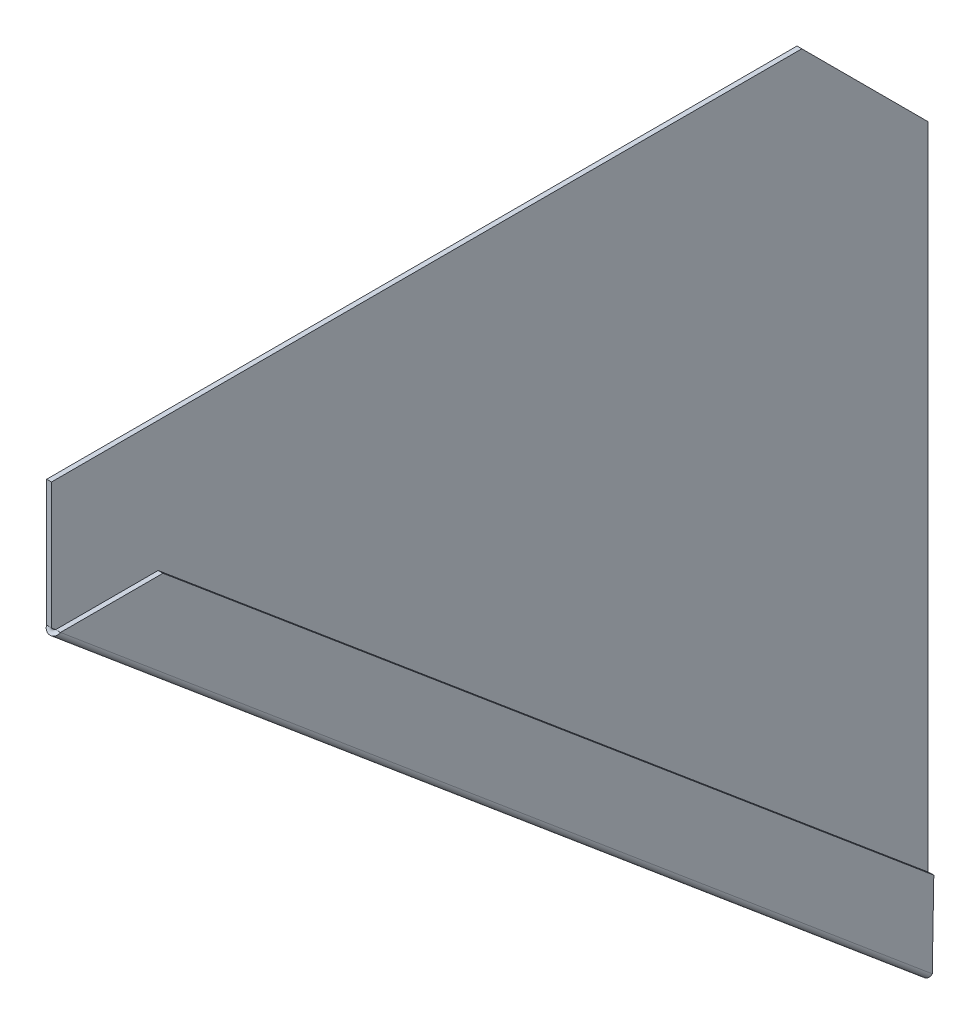
ISO-10303-21;
HEADER;
FILE_DESCRIPTION(('STEP AP214'),'2;1');
FILE_NAME('part.step','',(''),(''),'','','');
FILE_SCHEMA(('AUTOMOTIVE_DESIGN { 1 0 10303 214 1 1 1 1 }'));
ENDSEC;
DATA;
#1=APPLICATION_CONTEXT('core data for automotive mechanical design processes');
#2=APPLICATION_PROTOCOL_DEFINITION('international standard','automotive_design',2000,#1);
#3=PRODUCT_CONTEXT('',#1,'mechanical');
#4=PRODUCT('Part','Part','',(#3));
#5=PRODUCT_RELATED_PRODUCT_CATEGORY('part','',(#4));
#6=PRODUCT_DEFINITION_FORMATION('','',#4);
#7=PRODUCT_DEFINITION_CONTEXT('part definition',#1,'design');
#8=PRODUCT_DEFINITION('design','',#6,#7);
#9=PRODUCT_DEFINITION_SHAPE('','',#8);
#10=(LENGTH_UNIT() NAMED_UNIT(*) SI_UNIT(.MILLI.,.METRE.));
#11=(NAMED_UNIT(*) PLANE_ANGLE_UNIT() SI_UNIT($,.RADIAN.));
#12=(NAMED_UNIT(*) SI_UNIT($,.STERADIAN.) SOLID_ANGLE_UNIT());
#13=UNCERTAINTY_MEASURE_WITH_UNIT(LENGTH_MEASURE(1.E-05),#10,'distance_accuracy_value','');
#14=(GEOMETRIC_REPRESENTATION_CONTEXT(3) GLOBAL_UNCERTAINTY_ASSIGNED_CONTEXT((#13)) GLOBAL_UNIT_ASSIGNED_CONTEXT((#10,
#11,#12)) REPRESENTATION_CONTEXT('',''));
#15=CARTESIAN_POINT('',(0.,0.,0.));
#16=DIRECTION('',(0.,0.,1.));
#17=DIRECTION('',(1.,0.,0.));
#18=AXIS2_PLACEMENT_3D('',#15,#16,#17);
#19=CARTESIAN_POINT('',(0.05,-93.4944106675415,-0.424239822393119));
#20=DIRECTION('',(0.,-0.642787609686543,-0.766044443118975));
#21=DIRECTION('',(1.,0.,0.));
#22=AXIS2_PLACEMENT_3D('',#19,#20,#21);
#23=CYLINDRICAL_SURFACE('',#22,0.66);
#24=DIRECTION('',(0.,-0.642787609686543,-0.766044443118975));
#25=VECTOR('',#24,1.);
#26=CARTESIAN_POINT('',(-0.61,-93.4944106675415,-0.424239822393119));
#27=LINE('',#26,#25);
#28=CARTESIAN_POINT('',(-0.61,-92.9734940306687,0.196564451042147));
#29=VERTEX_POINT('',#28);
#30=CARTESIAN_POINT('',(-0.61,0.00162787163827149,111.));
#31=VERTEX_POINT('',#30);
#32=EDGE_CURVE('E169',#29,#31,#27,.F.);
#33=ORIENTED_EDGE('',*,*,#32,.F.);
#34=CARTESIAN_POINT('',(0.05,-92.9734940306687,0.196564451042144));
#35=DIRECTION('',(0.,0.64278760968654,0.766044443118977));
#36=DIRECTION('',(0.,0.766044443118977,-0.64278760968654));
#37=AXIS2_PLACEMENT_3D('',#34,#35,#36);
#38=CIRCLE('',#37,0.66);
#39=CARTESIAN_POINT('',(0.71,-92.9734940306688,0.196564451042199));
#40=VERTEX_POINT('',#39);
#41=EDGE_CURVE('E139',#29,#40,#38,.T.);
#42=ORIENTED_EDGE('',*,*,#41,.T.);
#43=DIRECTION('',(0.,0.642787609686543,0.766044443118975));
#44=VECTOR('',#43,1.);
#45=CARTESIAN_POINT('',(0.71,-46.924381137202,55.0757601776069));
#46=LINE('',#45,#44);
#47=CARTESIAN_POINT('',(0.71,-0.354351606862397,110.575760177607));
#48=VERTEX_POINT('',#47);
#49=EDGE_CURVE('E254',#40,#48,#46,.T.);
#50=ORIENTED_EDGE('',*,*,#49,.T.);
#51=CARTESIAN_POINT('',(-0.61,0.00162787163869582,111.));
#52=CARTESIAN_POINT('',(-0.610000229078599,-0.00849888260646574,111.004732032463));
#53=CARTESIAN_POINT('',(-0.609734955302613,-0.0186256219196172,111.009464052396));
#54=CARTESIAN_POINT('',(-0.60867504688825,-0.038859178923152,111.018911376037));
#55=CARTESIAN_POINT('',(-0.607880412249873,-0.0489659966135353,111.023626679745));
#56=CARTESIAN_POINT('',(-0.605763426957498,-0.0691398186128102,111.033023879765));
#57=CARTESIAN_POINT('',(-0.604441076303501,-0.0792068229217017,111.037705776079));
#58=CARTESIAN_POINT('',(-0.601271916850118,-0.0992812351727994,111.047019561417));
#59=CARTESIAN_POINT('',(-0.599425108050733,-0.109288643115006,111.051651450441));
#60=CARTESIAN_POINT('',(-0.595211462081673,-0.129224219774727,111.060848738885));
#61=CARTESIAN_POINT('',(-0.592844624911999,-0.139152388492241,111.065414138305));
#62=CARTESIAN_POINT('',(-0.587596629304977,-0.158910035662041,111.07446212618));
#63=CARTESIAN_POINT('',(-0.58471547086763,-0.168739514114326,111.078944714635));
#64=CARTESIAN_POINT('',(-0.578445772299098,-0.188280567219267,111.08781095851));
#65=CARTESIAN_POINT('',(-0.575057232167914,-0.197992141871923,111.09219461393));
#66=CARTESIAN_POINT('',(-0.567780933873921,-0.217278457950041,111.10084710806));
#67=CARTESIAN_POINT('',(-0.563893175711112,-0.226853199375503,111.105115946769));
#68=CARTESIAN_POINT('',(-0.555627807204068,-0.245847249197165,111.113523200391));
#69=CARTESIAN_POINT('',(-0.551250196859833,-0.255266557593364,111.117661615303));
#70=CARTESIAN_POINT('',(-0.542015670063422,-0.273931516010969,111.125792728449));
#71=CARTESIAN_POINT('',(-0.537158753611246,-0.283177166032374,111.129785426683));
#72=CARTESIAN_POINT('',(-0.526977315328931,-0.301477000711785,111.137610164635));
#73=CARTESIAN_POINT('',(-0.521652793498792,-0.31053118536979,111.141442204353));
#74=CARTESIAN_POINT('',(-0.510548971701942,-0.328430743591031,111.148931070476));
#75=CARTESIAN_POINT('',(-0.504769671735229,-0.337276117154267,111.152587896882));
#76=CARTESIAN_POINT('',(-0.492770216504538,-0.354741210498654,111.159712203687));
#77=CARTESIAN_POINT('',(-0.486550061240559,-0.363360930279805,111.163179684087));
#78=CARTESIAN_POINT('',(-0.473683880314327,-0.380358416992522,111.169911622341));
#79=CARTESIAN_POINT('',(-0.467037854652074,-0.388736183924087,111.173176080194));
#80=CARTESIAN_POINT('',(-0.453335943787202,-0.405234048755683,111.179488785911));
#81=CARTESIAN_POINT('',(-0.446280058584582,-0.413354146655714,111.182537033775));
#82=CARTESIAN_POINT('',(-0.431775426884458,-0.429321577989586,111.18840465294));
#83=CARTESIAN_POINT('',(-0.424326680386953,-0.437168911423428,111.191224024241));
#84=CARTESIAN_POINT('',(-0.409054270779806,-0.452576375503747,111.19662177509));
#85=CARTESIAN_POINT('',(-0.401230607670163,-0.460136506150225,111.199200154638));
#86=CARTESIAN_POINT('',(-0.385227212728443,-0.474955818231324,111.204104387361));
#87=CARTESIAN_POINT('',(-0.377047480896365,-0.482214999665946,111.206430240536));
#88=CARTESIAN_POINT('',(-0.360351654200215,-0.496419391911829,111.210818494253));
#89=CARTESIAN_POINT('',(-0.351835559336144,-0.50336460272309,111.212880894794));
#90=CARTESIAN_POINT('',(-0.334487522594458,-0.516928788693508,111.216731951661));
#91=CARTESIAN_POINT('',(-0.325655580716843,-0.523547763852667,111.218520607986));
#92=CARTESIAN_POINT('',(-0.30769712686964,-0.53644799942037,111.221814544315));
#93=CARTESIAN_POINT('',(-0.298570614900052,-0.542729259828915,111.223319824318));
#94=CARTESIAN_POINT('',(-0.280045007435628,-0.554943400381327,111.226038058572));
#95=CARTESIAN_POINT('',(-0.270645911940791,-0.560876280525193,111.227251012824));
#96=CARTESIAN_POINT('',(-0.251597780670174,-0.572383834312719,111.229376350384));
#97=CARTESIAN_POINT('',(-0.241948744894393,-0.577958507956379,111.230288733694));
#98=CARTESIAN_POINT('',(-0.222423978434238,-0.588740685458844,111.231805408281));
#99=CARTESIAN_POINT('',(-0.212548247749863,-0.59394818931765,111.232409699559));
#100=CARTESIAN_POINT('',(-0.192593882972736,-0.603987948509858,111.233303411216));
#101=CARTESIAN_POINT('',(-0.182515248879984,-0.60882020384326,111.233592831595));
#102=CARTESIAN_POINT('',(-0.162179357598432,-0.618102291250783,111.233850781137));
#103=CARTESIAN_POINT('',(-0.151922100409632,-0.622552123324905,111.2338193103));
#104=CARTESIAN_POINT('',(-0.131253673566965,-0.631063110770988,111.233430230149));
#105=CARTESIAN_POINT('',(-0.120842503913098,-0.635124266142951,111.233072620835));
#106=CARTESIAN_POINT('',(-0.0998913335599178,-0.642852583098186,111.232026802163));
#107=CARTESIAN_POINT('',(-0.089351332860605,-0.646519744681459,111.231338592806));
#108=CARTESIAN_POINT('',(-0.0681678922014045,-0.653455706138236,111.229627908928));
#109=CARTESIAN_POINT('',(-0.0575244522415167,-0.65672450601174,111.228605434407));
#110=CARTESIAN_POINT('',(-0.0361597740402866,-0.662860335816186,111.226223360355));
#111=CARTESIAN_POINT('',(-0.0254385357989442,-0.665727365747128,111.224863760823));
#112=CARTESIAN_POINT('',(-0.0039440894368019,-0.671057215332676,111.221805389067));
#113=CARTESIAN_POINT('',(0.00682911868399814,-0.673520034987281,111.220106616841));
#114=CARTESIAN_POINT('',(0.028401551203077,-0.678039997464262,111.21636866911));
#115=CARTESIAN_POINT('',(0.0392007756013557,-0.680097140286639,111.214329493605));
#116=CARTESIAN_POINT('',(0.0607992243979113,-0.683805259854365,111.209910328788));
#117=CARTESIAN_POINT('',(0.0715984487961882,-0.685456236599715,111.207530339477));
#118=CARTESIAN_POINT('',(0.0931708813152699,-0.688352513258186,111.202429957575));
#119=CARTESIAN_POINT('',(0.103944089436075,-0.689597813171307,111.199709564984));
#120=CARTESIAN_POINT('',(0.12543853579822,-0.691684202721214,111.193929607107));
#121=CARTESIAN_POINT('',(0.13615977403956,-0.692525292358001,111.190870041822));
#122=CARTESIAN_POINT('',(0.157524452240791,-0.693805701689001,111.184413786241));
#123=CARTESIAN_POINT('',(0.168167892200681,-0.694245021383215,111.181017095946));
#124=CARTESIAN_POINT('',(0.189351332859889,-0.694725299061889,111.17388945019));
#125=CARTESIAN_POINT('',(0.199891333559207,-0.694766257046349,111.170158494731));
#126=CARTESIAN_POINT('',(0.220842503912392,-0.694454179226554,111.162365983769));
#127=CARTESIAN_POINT('',(0.231253673566259,-0.694101143422298,111.158304428267));
#128=CARTESIAN_POINT('',(0.251922100408931,-0.693006395111668,111.149855178785));
#129=CARTESIAN_POINT('',(0.262179357597737,-0.692264682605294,111.145467484805));
#130=CARTESIAN_POINT('',(0.2825152488793,-0.690398834333232,111.13637120563));
#131=CARTESIAN_POINT('',(0.292593882972057,-0.689274698567545,111.131662620435));
#132=CARTESIAN_POINT('',(0.312548247749192,-0.686651178510781,111.121930579145));
#133=CARTESIAN_POINT('',(0.322423978433569,-0.685151794219704,111.11690712305));
#134=CARTESIAN_POINT('',(0.341948744893734,-0.681785855852694,111.106552118829));
#135=CARTESIAN_POINT('',(0.351597780669522,-0.679919301776761,111.101220570703));
#136=CARTESIAN_POINT('',(0.370645911940152,-0.675827987124687,111.09025690351));
#137=CARTESIAN_POINT('',(0.380045007434994,-0.673603226548546,111.084624784442));
#138=CARTESIAN_POINT('',(0.39857061489943,-0.668805325131589,111.073068220554));
#139=CARTESIAN_POINT('',(0.407697126869025,-0.666232184290774,111.067143775734));
#140=CARTESIAN_POINT('',(0.425655580716241,-0.660748187858516,111.055011509772));
#141=CARTESIAN_POINT('',(0.434487522593862,-0.657837332267073,111.04880368863));
#142=CARTESIAN_POINT('',(0.451835559335561,-0.651689385432083,111.03611430213));
#143=CARTESIAN_POINT('',(0.460351654199639,-0.648452294188535,111.029632736773));
#144=CARTESIAN_POINT('',(0.477047480895806,-0.641664141078102,111.016406153423));
#145=CARTESIAN_POINT('',(0.485227212727894,-0.638113079211217,111.009661135431));
#146=CARTESIAN_POINT('',(0.50123060766963,-0.630710006265576,110.995918573075));
#147=CARTESIAN_POINT('',(0.509054270779277,-0.62685799518682,110.98892102871));
#148=CARTESIAN_POINT('',(0.524326680386441,-0.618866770241935,110.974684948228));
#149=CARTESIAN_POINT('',(0.531775426883959,-0.614727556375807,110.96744641211));
#150=CARTESIAN_POINT('',(0.546280058584102,-0.606176364177374,110.952740463312));
#151=CARTESIAN_POINT('',(0.553335943786727,-0.601764385845071,110.945273050632));
#152=CARTESIAN_POINT('',(0.567037854651617,-0.592682760148941,110.930122015281));
#153=CARTESIAN_POINT('',(0.573683880313882,-0.588013112785115,110.922438392612));
#154=CARTESIAN_POINT('',(0.586550061240134,-0.578431865207837,110.906868124725));
#155=CARTESIAN_POINT('',(0.592770216504121,-0.573520264994383,110.898981479508));
#156=CARTESIAN_POINT('',(0.604769671734832,-0.563471410785441,110.88301884307));
#157=CARTESIAN_POINT('',(0.610548971701556,-0.558334156789954,110.874942851848));
#158=CARTESIAN_POINT('',(0.621652793498427,-0.547850837704154,110.858615656091));
#159=CARTESIAN_POINT('',(0.626977315328573,-0.542504772613843,110.850364451556));
#160=CARTESIAN_POINT('',(0.637158753610909,-0.53162117706986,110.833701383971));
#161=CARTESIAN_POINT('',(0.642015670063098,-0.526083646616189,110.825289520921));
#162=CARTESIAN_POINT('',(0.651250196859532,-0.514834927334035,110.808320078142));
#163=CARTESIAN_POINT('',(0.655627807203778,-0.509123738505553,110.799762498413));
#164=CARTESIAN_POINT('',(0.663893175710843,-0.497545927819316,110.782516915158));
#165=CARTESIAN_POINT('',(0.667780933873662,-0.49167930596156,110.773828911632));
#166=CARTESIAN_POINT('',(0.675057232167678,-0.479809229018883,110.756338087869));
#167=CARTESIAN_POINT('',(0.678445772298874,-0.473805773933962,110.747535267632));
#168=CARTESIAN_POINT('',(0.684715470867429,-0.461680959964465,110.729830694124));
#169=CARTESIAN_POINT('',(0.687596629304788,-0.455559601079891,110.720928940853));
#170=CARTESIAN_POINT('',(0.692844624911833,-0.44321819304553,110.703042623345));
#171=CARTESIAN_POINT('',(0.695211462081519,-0.436998143895744,110.694058059108));
#172=CARTESIAN_POINT('',(0.699425108050602,-0.424478806371456,110.676022441031));
#173=CARTESIAN_POINT('',(0.701271916849999,-0.418179517996955,110.66697138719));
#174=CARTESIAN_POINT('',(0.704441076303406,-0.405521344881291,110.648819272219));
#175=CARTESIAN_POINT('',(0.705763426957414,-0.39916246014013,110.639718211089));
#176=CARTESIAN_POINT('',(0.707880412249813,-0.386404877276293,110.621482681435));
#177=CARTESIAN_POINT('',(0.708675046888202,-0.380006179153617,110.612348212911));
#178=CARTESIAN_POINT('',(0.70973495530259,-0.367188861285508,110.594062559637));
#179=CARTESIAN_POINT('',(0.710000229078587,-0.360770241540074,110.584911374887));
#180=CARTESIAN_POINT('',(0.71,-0.354351606862646,110.575760177607));
#181=B_SPLINE_CURVE_WITH_KNOTS('',3,(#51,#52,#53,#54,#55,#56,#57,#58,#59,#60,#61,#62,#63,#64,
#65,#66,#67,#68,#69,#70,#71,#72,#73,#74,#75,#76,#77,#78,#79,#80,#81,#82,#83,#84,#85,#86,#87,#88,
#89,#90,#91,#92,#93,#94,#95,#96,#97,#98,#99,#100,#101,#102,#103,#104,#105,#106,#107,#108,#109,
#110,#111,#112,#113,#114,#115,#116,#117,#118,#119,#120,#121,#122,#123,#124,#125,#126,#127,#128,
#129,#130,#131,#132,#133,#134,#135,#136,#137,#138,#139,#140,#141,#142,#143,#144,#145,#146,#147,
#148,#149,#150,#151,#152,#153,#154,#155,#156,#157,#158,#159,#160,#161,#162,#163,#164,#165,#166,
#167,#168,#169,#170,#171,#172,#173,#174,#175,#176,#177,#178,#179,#180),.UNSPECIFIED.,.F.,.F.,(4,
2,2,2,2,2,2,2,2,2,2,2,2,2,2,2,2,2,2,2,2,2,2,2,2,2,2,2,2,2,2,2,2,2,2,2,2,2,2,2,2,2,2,2,2,2,2,2,2,
2,2,2,2,2,2,2,2,2,2,2,2,2,2,2,4),(0.,0.0335302353550522,0.0670604707100767,0.100590706065126,
0.13412094142016,0.167651176775207,0.201181412130251,0.234711647485295,0.268241882840335,
0.301772118195361,0.335302353550414,0.368832588905447,0.40236282426049,0.435893059615528,
0.469423294970569,0.502953530325616,0.536483765680649,0.570014001035691,0.603544236390736,
0.637074471745776,0.670604707100812,0.704134942455851,0.737665177810894,0.771195413165931,
0.804725648520979,0.838255883876013,0.871786119231063,0.905316354586097,0.938846589941141,
0.97237682529618,1.00590706065122,1.03943729600626,1.0729675313613,1.10649776671634,
1.14002800207138,1.17355823742642,1.20708847278146,1.2406187081365,1.27414894349154,
1.30767917884659,1.34120941420162,1.37473964955667,1.4082698849117,1.44180012026674,
1.47533035562179,1.50886059097683,1.54239082633188,1.57592106168692,1.60945129704197,
1.64298153239699,1.67651176775203,1.71004200310707,1.74357223846211,1.77710247381716,
1.8106327091722,1.84416294452724,1.87769317988227,1.91122341523732,1.94475365059235,
1.97828388594739,2.01181412130244,2.04534435665747,2.07887459201253,2.11240482736755,
2.1459350627226),.UNSPECIFIED.);
#182=EDGE_CURVE('E237',#31,#48,#181,.T.);
#183=ORIENTED_EDGE('',*,*,#182,.F.);
#184=EDGE_LOOP('',(#33,#42,#50,#183));
#185=FACE_BOUND('',#184,.T.);
#186=ADVANCED_FACE('F45',(#185),#23,.T.);
#187=CARTESIAN_POINT('',(0.05,-93.4944106675415,-0.424239822393119));
#188=DIRECTION('',(0.,-0.642787609686543,-0.766044443118975));
#189=DIRECTION('',(1.,0.,0.));
#190=AXIS2_PLACEMENT_3D('',#187,#188,#189);
#191=CYLINDRICAL_SURFACE('',#190,0.05);
#192=CARTESIAN_POINT('',(0.05,-92.9734940306687,0.196564451042144));
#193=DIRECTION('',(0.,0.642787609686543,0.766044443118975));
#194=DIRECTION('',(0.,-0.766044443118975,0.642787609686543));
#195=AXIS2_PLACEMENT_3D('',#192,#193,#194);
#196=CIRCLE('',#195,0.05);
#197=CARTESIAN_POINT('',(0.,-92.9734940306687,0.196564451042145));
#198=VERTEX_POINT('',#197);
#199=CARTESIAN_POINT('',(0.1,-92.9734940306687,0.196564451042161));
#200=VERTEX_POINT('',#199);
#201=EDGE_CURVE('E136',#198,#200,#196,.T.);
#202=ORIENTED_EDGE('',*,*,#201,.F.);
#203=DIRECTION('',(0.,-0.642787609686543,-0.766044443118975));
#204=VECTOR('',#203,1.);
#205=CARTESIAN_POINT('',(0.,-93.4944106675415,-0.424239822393117));
#206=LINE('',#205,#204);
#207=CARTESIAN_POINT('',(0.,0.00162787163826561,111.));
#208=VERTEX_POINT('',#207);
#209=EDGE_CURVE('E151',#198,#208,#206,.F.);
#210=ORIENTED_EDGE('',*,*,#209,.T.);
#211=CARTESIAN_POINT('',(0.,0.00162787163844602,111.));
#212=CARTESIAN_POINT('',(-4.36261635620498E-06,-0.00829588603603223,110.993265728248));
#213=CARTESIAN_POINT('',(0.00032114073050845,-0.0182184923180172,110.986530490363));
#214=CARTESIAN_POINT('',(0.00160033122915754,-0.0379679849263771,110.972979696014));
#215=CARTESIAN_POINT('',(0.00255401838094183,-0.0477948712527522,110.96616413955));
#216=CARTESIAN_POINT('',(0.00505802836790877,-0.0672595067792774,110.952374321728));
#217=CARTESIAN_POINT('',(0.00660835120309167,-0.0768972559794276,110.945400060371));
#218=CARTESIAN_POINT('',(0.0102446875666215,-0.095898454158211,110.931221372441));
#219=CARTESIAN_POINT('',(0.0123307010949679,-0.105261903136844,110.92401694587));
#220=CARTESIAN_POINT('',(0.0169586207863391,-0.123639614878655,110.909315090701));
#221=CARTESIAN_POINT('',(0.019500526949364,-0.132653877641832,110.901817662105));
#222=CARTESIAN_POINT('',(0.0249424497486301,-0.15027182075697,110.886478285362));
#223=CARTESIAN_POINT('',(0.0278424663848714,-0.158875501108932,110.878636337215));
#224=CARTESIAN_POINT('',(0.0338891903785679,-0.175626642688999,110.862569627624));
#225=CARTESIAN_POINT('',(0.0370358977360229,-0.183774103917103,110.854344866179));
#226=CARTESIAN_POINT('',(0.0434550700623096,-0.199584707888852,110.837488951828));
#227=CARTESIAN_POINT('',(0.0467275350311412,-0.207247850632497,110.828857798921));
#228=CARTESIAN_POINT('',(0.0532724649688033,-0.222080328903367,110.811181139655));
#229=CARTESIAN_POINT('',(0.0565449299376338,-0.229249664430592,110.802135633295));
#230=CARTESIAN_POINT('',(0.0629641022639228,-0.243104017000574,110.783638229114));
#231=CARTESIAN_POINT('',(0.0661108096213813,-0.249789034043332,110.774186331292));
#232=CARTESIAN_POINT('',(0.0721575336150809,-0.262702849005011,110.754899722351));
#233=CARTESIAN_POINT('',(0.0750575502513215,-0.268931646923931,110.745065011231));
#234=CARTESIAN_POINT('',(0.0804994730505904,-0.280978660350534,110.725051069441));
#235=CARTESIAN_POINT('',(0.083041379213619,-0.286796875858216,110.714871838771));
#236=CARTESIAN_POINT('',(0.0876692989049958,-0.298084120658133,110.694220375407));
#237=CARTESIAN_POINT('',(0.0897553124333442,-0.303553149950368,110.683748142712));
#238=CARTESIAN_POINT('',(0.0933916487968796,-0.314216908313321,110.662573512109));
#239=CARTESIAN_POINT('',(0.0949419716320667,-0.319411637384039,110.651871114199));
#240=CARTESIAN_POINT('',(0.0974459816190412,-0.329611958399245,110.630307613488));
#241=CARTESIAN_POINT('',(0.0983996687708286,-0.334617550343733,110.619446510686));
#242=CARTESIAN_POINT('',(0.0996788592694838,-0.344533014277107,110.597643986503));
#243=CARTESIAN_POINT('',(0.100004362616352,-0.349442886265994,110.586702565121));
#244=CARTESIAN_POINT('',(0.1,-0.354351606862396,110.575760177607));
#245=B_SPLINE_CURVE_WITH_KNOTS('',3,(#211,#212,#213,#214,#215,#216,#217,#218,#219,#220,#221,
#222,#223,#224,#225,#226,#227,#228,#229,#230,#231,#232,#233,#234,#235,#236,#237,#238,#239,#240,
#241,#242,#243,#244),.UNSPECIFIED.,.F.,.F.,(4,2,2,2,2,2,2,2,2,2,2,2,2,2,2,2,4),(0.,
0.0359739302906177,0.0719478605812272,0.107921790871851,0.143895721162445,0.179869651453056,
0.215843581743672,0.251817512034282,0.287791442324889,0.323765372615495,0.359739302906079,
0.395713233196717,0.431687163487326,0.467661093777923,0.503635024068521,0.539608954359131,
0.575582884649743),.UNSPECIFIED.);
#246=CARTESIAN_POINT('',(0.1,-0.35435160686241,110.575760177607));
#247=VERTEX_POINT('',#246);
#248=EDGE_CURVE('E166',#208,#247,#245,.T.);
#249=ORIENTED_EDGE('',*,*,#248,.T.);
#250=DIRECTION('',(0.,0.642787609686543,0.766044443118975));
#251=VECTOR('',#250,1.);
#252=CARTESIAN_POINT('',(0.1,-46.924381137202,55.0757601776069));
#253=LINE('',#252,#251);
#254=EDGE_CURVE('E153',#200,#247,#253,.T.);
#255=ORIENTED_EDGE('',*,*,#254,.F.);
#256=EDGE_LOOP('',(#202,#210,#249,#255));
#257=FACE_BOUND('',#256,.T.);
#258=ADVANCED_FACE('F148',(#257),#191,.F.);
#259=CARTESIAN_POINT('',(-0.61,-94.,0.));
#260=DIRECTION('',(0.,0.,-1.));
#261=DIRECTION('',(-1.,0.,0.));
#262=AXIS2_PLACEMENT_3D('',#259,#260,#261);
#263=PLANE('',#262);
#264=DIRECTION('',(0.,1.,0.));
#265=VECTOR('',#264,1.);
#266=CARTESIAN_POINT('',(0.,-94.,0.));
#267=LINE('',#266,#265);
#268=CARTESIAN_POINT('',(0.,-82.2513343961032,0.));
#269=VERTEX_POINT('',#268);
#270=CARTESIAN_POINT('',(0.,0.,0.));
#271=VERTEX_POINT('',#270);
#272=EDGE_CURVE('E261',#269,#271,#267,.T.);
#273=ORIENTED_EDGE('',*,*,#272,.F.);
#274=DIRECTION('',(1.,0.,0.));
#275=VECTOR('',#274,1.);
#276=CARTESIAN_POINT('',(-0.61,-82.2513343961032,0.));
#277=LINE('',#276,#275);
#278=CARTESIAN_POINT('',(-0.61,-82.2513343961032,0.));
#279=VERTEX_POINT('',#278);
#280=EDGE_CURVE('E144',#269,#279,#277,.F.);
#281=ORIENTED_EDGE('',*,*,#280,.T.);
#282=DIRECTION('',(0.,1.,0.));
#283=VECTOR('',#282,1.);
#284=CARTESIAN_POINT('',(-0.61,-94.,0.));
#285=LINE('',#284,#283);
#286=CARTESIAN_POINT('',(-0.61,0.,0.));
#287=VERTEX_POINT('',#286);
#288=EDGE_CURVE('E85',#279,#287,#285,.T.);
#289=ORIENTED_EDGE('',*,*,#288,.T.);
#290=DIRECTION('',(1.,0.,0.));
#291=VECTOR('',#290,1.);
#292=CARTESIAN_POINT('',(-0.61,0.,0.));
#293=LINE('',#292,#291);
#294=EDGE_CURVE('E49',#287,#271,#293,.T.);
#295=ORIENTED_EDGE('',*,*,#294,.T.);
#296=EDGE_LOOP('',(#273,#281,#289,#295));
#297=FACE_BOUND('',#296,.T.);
#298=ADVANCED_FACE('F47',(#297),#263,.T.);
#299=CARTESIAN_POINT('',(-0.61,0.,0.));
#300=DIRECTION('',(1.,0.,0.));
#301=DIRECTION('',(0.,0.,-1.));
#302=AXIS2_PLACEMENT_3D('',#299,#300,#301);
#303=PLANE('',#302);
#304=DIRECTION('',(0.,-0.999832001281003,0.0183294630151621));
#305=VECTOR('',#304,1.);
#306=CARTESIAN_POINT('',(-0.61,-0.027633916202369,-1.50736951306164));
#307=LINE('',#306,#305);
#308=EDGE_CURVE('E160',#279,#29,#307,.T.);
#309=ORIENTED_EDGE('',*,*,#308,.T.);
#310=ORIENTED_EDGE('',*,*,#32,.T.);
#311=DIRECTION('',(0.,-1.,0.));
#312=VECTOR('',#311,1.);
#313=CARTESIAN_POINT('',(-0.61,16.,111.));
#314=LINE('',#313,#312);
#315=CARTESIAN_POINT('',(-0.61,16.,111.));
#316=VERTEX_POINT('',#315);
#317=EDGE_CURVE('E267',#316,#31,#314,.T.);
#318=ORIENTED_EDGE('',*,*,#317,.F.);
#319=DIRECTION('',(0.,0.,1.));
#320=VECTOR('',#319,1.);
#321=CARTESIAN_POINT('',(-0.61,16.,16.0000000000001));
#322=LINE('',#321,#320);
#323=CARTESIAN_POINT('',(-0.61,16.,16.0000000000001));
#324=VERTEX_POINT('',#323);
#325=EDGE_CURVE('E265',#324,#316,#322,.T.);
#326=ORIENTED_EDGE('',*,*,#325,.F.);
#327=DIRECTION('',(0.,0.707106781186546,0.707106781186549));
#328=VECTOR('',#327,1.);
#329=CARTESIAN_POINT('',(-0.61,0.,0.));
#330=LINE('',#329,#328);
#331=EDGE_CURVE('E263',#287,#324,#330,.T.);
#332=ORIENTED_EDGE('',*,*,#331,.F.);
#333=ORIENTED_EDGE('',*,*,#288,.F.);
#334=EDGE_LOOP('',(#309,#310,#318,#326,#332,#333));
#335=FACE_BOUND('',#334,.T.);
#336=ADVANCED_FACE('F216',(#335),#303,.F.);
#337=CARTESIAN_POINT('',(0.,0.,0.));
#338=DIRECTION('',(1.,0.,0.));
#339=DIRECTION('',(0.,0.,-1.));
#340=AXIS2_PLACEMENT_3D('',#337,#338,#339);
#341=PLANE('',#340);
#342=ORIENTED_EDGE('',*,*,#209,.F.);
#343=DIRECTION('',(0.,-0.999832001281003,0.0183294630151621));
#344=VECTOR('',#343,1.);
#345=CARTESIAN_POINT('',(0.,-0.027633916202369,-1.50736951306164));
#346=LINE('',#345,#344);
#347=EDGE_CURVE('E156',#269,#198,#346,.T.);
#348=ORIENTED_EDGE('',*,*,#347,.F.);
#349=ORIENTED_EDGE('',*,*,#272,.T.);
#350=DIRECTION('',(0.,0.707106781186546,0.707106781186549));
#351=VECTOR('',#350,1.);
#352=CARTESIAN_POINT('',(0.,0.,0.));
#353=LINE('',#352,#351);
#354=CARTESIAN_POINT('',(0.,16.,16.0000000000001));
#355=VERTEX_POINT('',#354);
#356=EDGE_CURVE('E270',#271,#355,#353,.T.);
#357=ORIENTED_EDGE('',*,*,#356,.T.);
#358=DIRECTION('',(0.,0.,1.));
#359=VECTOR('',#358,1.);
#360=CARTESIAN_POINT('',(0.,16.,16.0000000000001));
#361=LINE('',#360,#359);
#362=CARTESIAN_POINT('',(0.,16.,111.));
#363=VERTEX_POINT('',#362);
#364=EDGE_CURVE('E273',#355,#363,#361,.T.);
#365=ORIENTED_EDGE('',*,*,#364,.T.);
#366=DIRECTION('',(0.,-1.,0.));
#367=VECTOR('',#366,1.);
#368=CARTESIAN_POINT('',(0.,16.,111.));
#369=LINE('',#368,#367);
#370=EDGE_CURVE('E164',#363,#208,#369,.T.);
#371=ORIENTED_EDGE('',*,*,#370,.T.);
#372=EDGE_LOOP('',(#342,#348,#349,#357,#365,#371));
#373=FACE_BOUND('',#372,.T.);
#374=ADVANCED_FACE('F163',(#373),#341,.T.);
#375=CARTESIAN_POINT('',(0.71,-40.5355704815897,49.7149115128211));
#376=DIRECTION('',(0.,-0.766044443118975,0.642787609686543));
#377=DIRECTION('',(0.,-0.642787609686543,-0.766044443118975));
#378=AXIS2_PLACEMENT_3D('',#375,#376,#377);
#379=PLANE('',#378);
#380=DIRECTION('',(0.,-0.642787609686543,-0.766044443118975));
#381=VECTOR('',#380,1.);
#382=CARTESIAN_POINT('',(0.71,-40.5355704815897,49.7149115128211));
#383=LINE('',#382,#381);
#384=CARTESIAN_POINT('',(0.71,-0.354351606862396,97.6010234615912));
#385=VERTEX_POINT('',#384);
#386=CARTESIAN_POINT('',(0.71,-82.2513343960095,0.));
#387=VERTEX_POINT('',#386);
#388=EDGE_CURVE('E250',#385,#387,#383,.T.);
#389=ORIENTED_EDGE('',*,*,#388,.T.);
#390=DIRECTION('',(-1.,0.,0.));
#391=VECTOR('',#390,1.);
#392=CARTESIAN_POINT('',(0.71,-82.2513343960095,0.));
#393=LINE('',#392,#391);
#394=CARTESIAN_POINT('',(0.1,-82.2513343960095,0.));
#395=VERTEX_POINT('',#394);
#396=EDGE_CURVE('E289',#395,#387,#393,.F.);
#397=ORIENTED_EDGE('',*,*,#396,.F.);
#398=DIRECTION('',(0.,-0.642787609686543,-0.766044443118975));
#399=VECTOR('',#398,1.);
#400=CARTESIAN_POINT('',(0.1,-40.5355704815897,49.7149115128211));
#401=LINE('',#400,#399);
#402=CARTESIAN_POINT('',(0.1,-0.354351606862396,97.6010234615912));
#403=VERTEX_POINT('',#402);
#404=EDGE_CURVE('E256',#403,#395,#401,.T.);
#405=ORIENTED_EDGE('',*,*,#404,.F.);
#406=DIRECTION('',(1.,0.,0.));
#407=VECTOR('',#406,1.);
#408=CARTESIAN_POINT('',(0.1,-0.354351606862396,97.6010234615912));
#409=LINE('',#408,#407);
#410=EDGE_CURVE('E167',#403,#385,#409,.T.);
#411=ORIENTED_EDGE('',*,*,#410,.T.);
#412=EDGE_LOOP('',(#389,#397,#405,#411));
#413=FACE_BOUND('',#412,.T.);
#414=ADVANCED_FACE('F207',(#413),#379,.F.);
#415=CARTESIAN_POINT('',(0.71,-43.7299758093958,52.395335845214));
#416=DIRECTION('',(1.,0.,0.));
#417=DIRECTION('',(0.,0.,-1.));
#418=AXIS2_PLACEMENT_3D('',#415,#416,#417);
#419=PLANE('',#418);
#420=ORIENTED_EDGE('',*,*,#49,.F.);
#421=DIRECTION('',(0.,0.999832001281003,-0.0183294630151621));
#422=VECTOR('',#421,1.);
#423=CARTESIAN_POINT('',(0.71,-44.7031348281846,-0.688353977850865));
#424=LINE('',#423,#422);
#425=EDGE_CURVE('E291',#40,#387,#424,.T.);
#426=ORIENTED_EDGE('',*,*,#425,.T.);
#427=ORIENTED_EDGE('',*,*,#388,.F.);
#428=DIRECTION('',(0.,0.,-1.));
#429=VECTOR('',#428,1.);
#430=CARTESIAN_POINT('',(0.71,-0.354351606862397,110.575760177607));
#431=LINE('',#430,#429);
#432=EDGE_CURVE('E143',#48,#385,#431,.T.);
#433=ORIENTED_EDGE('',*,*,#432,.F.);
#434=EDGE_LOOP('',(#420,#426,#427,#433));
#435=FACE_BOUND('',#434,.T.);
#436=ADVANCED_FACE('F198',(#435),#419,.T.);
#437=CARTESIAN_POINT('',(0.1,-43.7299758093958,52.395335845214));
#438=DIRECTION('',(1.,0.,0.));
#439=DIRECTION('',(0.,0.,-1.));
#440=AXIS2_PLACEMENT_3D('',#437,#438,#439);
#441=PLANE('',#440);
#442=DIRECTION('',(0.,0.999832001281003,-0.0183294630151621));
#443=VECTOR('',#442,1.);
#444=CARTESIAN_POINT('',(0.1,-44.7031348281846,-0.688353977850865));
#445=LINE('',#444,#443);
#446=EDGE_CURVE('E292',#200,#395,#445,.T.);
#447=ORIENTED_EDGE('',*,*,#446,.F.);
#448=ORIENTED_EDGE('',*,*,#254,.T.);
#449=DIRECTION('',(0.,0.,-1.));
#450=VECTOR('',#449,1.);
#451=CARTESIAN_POINT('',(0.1,-0.354351606862397,110.575760177607));
#452=LINE('',#451,#450);
#453=EDGE_CURVE('E283',#247,#403,#452,.T.);
#454=ORIENTED_EDGE('',*,*,#453,.T.);
#455=ORIENTED_EDGE('',*,*,#404,.T.);
#456=EDGE_LOOP('',(#447,#448,#454,#455));
#457=FACE_BOUND('',#456,.T.);
#458=ADVANCED_FACE('F206',(#457),#441,.F.);
#459=CARTESIAN_POINT('',(-0.61,16.,111.));
#460=DIRECTION('',(0.,0.,1.));
#461=DIRECTION('',(1.,0.,0.));
#462=AXIS2_PLACEMENT_3D('',#459,#460,#461);
#463=PLANE('',#462);
#464=DIRECTION('',(-1.,0.,0.));
#465=VECTOR('',#464,1.);
#466=CARTESIAN_POINT('',(0.,0.0016278716380852,111.));
#467=LINE('',#466,#465);
#468=EDGE_CURVE('E239',#208,#31,#467,.T.);
#469=ORIENTED_EDGE('',*,*,#468,.F.);
#470=ORIENTED_EDGE('',*,*,#370,.F.);
#471=DIRECTION('',(1.,0.,0.));
#472=VECTOR('',#471,1.);
#473=CARTESIAN_POINT('',(-0.61,16.,111.));
#474=LINE('',#473,#472);
#475=EDGE_CURVE('E11',#316,#363,#474,.T.);
#476=ORIENTED_EDGE('',*,*,#475,.F.);
#477=ORIENTED_EDGE('',*,*,#317,.T.);
#478=EDGE_LOOP('',(#469,#470,#476,#477));
#479=FACE_BOUND('',#478,.T.);
#480=ADVANCED_FACE('F211',(#479),#463,.T.);
#481=CARTESIAN_POINT('',(-0.61,16.,16.0000000000001));
#482=DIRECTION('',(0.,1.,0.));
#483=DIRECTION('',(0.,0.,1.));
#484=AXIS2_PLACEMENT_3D('',#481,#482,#483);
#485=PLANE('',#484);
#486=ORIENTED_EDGE('',*,*,#364,.F.);
#487=DIRECTION('',(1.,0.,0.));
#488=VECTOR('',#487,1.);
#489=CARTESIAN_POINT('',(-0.61,16.,16.0000000000001));
#490=LINE('',#489,#488);
#491=EDGE_CURVE('E55',#324,#355,#490,.T.);
#492=ORIENTED_EDGE('',*,*,#491,.F.);
#493=ORIENTED_EDGE('',*,*,#325,.T.);
#494=ORIENTED_EDGE('',*,*,#475,.T.);
#495=EDGE_LOOP('',(#486,#492,#493,#494));
#496=FACE_BOUND('',#495,.T.);
#497=ADVANCED_FACE('F224',(#496),#485,.T.);
#498=CARTESIAN_POINT('',(-0.61,0.,0.));
#499=DIRECTION('',(0.,0.707106781186549,-0.707106781186546));
#500=DIRECTION('',(0.,0.707106781186546,0.707106781186549));
#501=AXIS2_PLACEMENT_3D('',#498,#499,#500);
#502=PLANE('',#501);
#503=ORIENTED_EDGE('',*,*,#356,.F.);
#504=ORIENTED_EDGE('',*,*,#294,.F.);
#505=ORIENTED_EDGE('',*,*,#331,.T.);
#506=ORIENTED_EDGE('',*,*,#491,.T.);
#507=EDGE_LOOP('',(#503,#504,#505,#506));
#508=FACE_BOUND('',#507,.T.);
#509=ADVANCED_FACE('F196',(#508),#502,.T.);
#510=CARTESIAN_POINT('',(-0.6161,0.00162787163872934,111.));
#511=CARTESIAN_POINT('',(-0.616100000000053,-0.0800115405260837,111.038375898298));
#512=CARTESIAN_POINT('',(-0.598763199928851,-0.161597137153817,111.076716872051));
#513=CARTESIAN_POINT('',(-0.532029113282939,-0.314679772124307,111.144923281968));
#514=CARTESIAN_POINT('',(-0.482658083721659,-0.386114483241608,111.174741535407));
#515=CARTESIAN_POINT('',(-0.35934957017559,-0.510239241374673,111.218649401551));
#516=CARTESIAN_POINT('',(-0.285460602825408,-0.5628921224921,111.232707828364));
#517=CARTESIAN_POINT('',(-0.124350265772093,-0.643678355275693,111.240250353871));
#518=CARTESIAN_POINT('',(-0.0371922861068903,-0.671791592902627,111.233717574882));
#519=CARTESIAN_POINT('',(0.137192286106151,-0.701456549444435,111.198364256349));
#520=CARTESIAN_POINT('',(0.22435026577131,-0.703008268359306,111.169543716806));
#521=CARTESIAN_POINT('',(0.385460602824653,-0.681551948659347,111.091294554233));
#522=CARTESIAN_POINT('',(0.459349570175044,-0.658564024083663,111.041882808887));
#523=CARTESIAN_POINT('',(0.582658083721249,-0.593769179034151,110.927268305678));
#524=CARTESIAN_POINT('',(0.632029113282527,-0.551999424458709,110.862096733707));
#525=CARTESIAN_POINT('',(0.698763199928634,-0.458246702571752,110.723183686724));
#526=CARTESIAN_POINT('',(0.716099999999953,-0.40632102418358,110.649495398852));
#527=CARTESIAN_POINT('',(0.7161,-0.354351606862644,110.575760177607));
#528=CARTESIAN_POINT('',(-0.61,0.00162787163872647,111.));
#529=CARTESIAN_POINT('',(-0.610000000000053,-0.0793997294537552,111.037862574503));
#530=CARTESIAN_POINT('',(-0.592821966601174,-0.160374023028718,111.075690557439));
#531=CARTESIAN_POINT('',(-0.526699016313976,-0.312326425543998,111.142948589721));
#532=CARTESIAN_POINT('',(-0.477780115983028,-0.38324278563238,111.172331895002));
#533=CARTESIAN_POINT('',(-0.35560083518374,-0.506502501294784,111.215513904328));
#534=CARTESIAN_POINT('',(-0.282388527045142,-0.558809031327744,111.229281708074));
#535=CARTESIAN_POINT('',(-0.122753603677498,-0.639127106499753,111.236431402702));
#536=CARTESIAN_POINT('',(-0.0363937979740994,-0.667118721799602,111.229796570463));
#537=CARTESIAN_POINT('',(0.136393797973367,-0.696783678341409,111.19444325193));
#538=CARTESIAN_POINT('',(0.222753603676722,-0.698457019583365,111.165724765636));
#539=CARTESIAN_POINT('',(0.382388527044395,-0.677468857494988,111.087868433943));
#540=CARTESIAN_POINT('',(0.455600835183199,-0.654827284003772,111.038747311664));
#541=CARTESIAN_POINT('',(0.577780115982622,-0.590897481424919,110.924858665273));
#542=CARTESIAN_POINT('',(0.626699016313568,-0.549646077878395,110.860122041459));
#543=CARTESIAN_POINT('',(0.692821966600959,-0.457023588446648,110.722157372112));
#544=CARTESIAN_POINT('',(0.709999999999953,-0.405709259052381,110.648982020306));
#545=CARTESIAN_POINT('',(0.71,-0.354351606862641,110.575760177607));
#546=CARTESIAN_POINT('',(0.,0.00162787163843952,111.));
#547=CARTESIAN_POINT('',(0.,-0.0182186222209036,110.986530194974));
#548=CARTESIAN_POINT('',(0.00130136616657696,-0.0380626105188808,110.973059096314));
#549=CARTESIAN_POINT('',(0.00631068058227313,-0.0769917675131548,110.945479364964));
#550=CARTESIAN_POINT('',(0.0100166578800739,-0.0960730247095879,110.931367854527));
#551=CARTESIAN_POINT('',(0.0192726640012321,-0.132828493305916,110.901964182044));
#552=CARTESIAN_POINT('',(0.0248190509814308,-0.150499914892102,110.886669679066));
#553=CARTESIAN_POINT('',(0.036912605782009,-0.184002228905823,110.854536285773));
#554=CARTESIAN_POINT('',(0.0434550153049935,-0.199831611497061,110.837696128554));
#555=CARTESIAN_POINT('',(0.056544984694951,-0.229496568038801,110.802342810021));
#556=CARTESIAN_POINT('',(0.063087394217937,-0.243332141989289,110.783829648708));
#557=CARTESIAN_POINT('',(0.0751809490185208,-0.269159741059041,110.745256404935));
#558=CARTESIAN_POINT('',(0.0807273359987236,-0.28115327601461,110.72519758938));
#559=CARTESIAN_POINT('',(0.089983342119892,-0.303727720501755,110.683894624797));
#560=CARTESIAN_POINT('',(0.093689319417699,-0.314311419847047,110.662652816702));
#561=CARTESIAN_POINT('',(0.0986986338334086,-0.334712175936241,110.619525910986));
#562=CARTESIAN_POINT('',(0.0999999999999964,-0.344532745932439,110.597644165726));
#563=CARTESIAN_POINT('',(0.1,-0.35435160686239,110.575760177607));
#564=CARTESIAN_POINT('',(0.006161,0.00162787163843662,111.));
#565=CARTESIAN_POINT('',(0.00616099999999686,-0.0176006930378518,110.98601173794));
#566=CARTESIAN_POINT('',(0.00730201182753124,-0.0368272652525314,110.972022518556));
#567=CARTESIAN_POINT('',(0.0116940785209253,-0.0746148874670433,110.943484925794));
#568=CARTESIAN_POINT('',(0.0149434052960913,-0.0931726101242677,110.928934117718));
#569=CARTESIAN_POINT('',(0.0230588863430003,-0.129054385825228,110.898797329849));
#570=CARTESIAN_POINT('',(0.0279218475194992,-0.146375992816102,110.883209297573));
#571=CARTESIAN_POINT('',(0.03852523449755,-0.179405467642124,110.850679145092));
#572=CARTESIAN_POINT('',(0.0442614883191124,-0.195112011683006,110.833735914091));
#573=CARTESIAN_POINT('',(0.055738511680839,-0.224776968224744,110.798382595558));
#574=CARTESIAN_POINT('',(0.0614747655024033,-0.238735380725589,110.779972508027));
#575=CARTESIAN_POINT('',(0.0720781524804594,-0.265035818983037,110.741796023442));
#576=CARTESIAN_POINT('',(0.0769411136569604,-0.277379168533919,110.722030737185));
#577=CARTESIAN_POINT('',(0.0850565947038784,-0.300827305916431,110.681460887989));
#578=CARTESIAN_POINT('',(0.0883059214790507,-0.31193453980093,110.660658377532));
#579=CARTESIAN_POINT('',(0.0926979881724563,-0.333476830669886,110.618489333229));
#580=CARTESIAN_POINT('',(0.0938389999999969,-0.343914863149927,110.597125653395));
#581=CARTESIAN_POINT('',(0.093839,-0.354351606862387,110.575760177607));
#582=B_SPLINE_SURFACE_WITH_KNOTS('',1,3,((#510,#511,#512,#513,#514,#515,#516,#517,#518,#519,
#520,#521,#522,#523,#524,#525,#526,#527),(#528,#529,#530,#531,#532,#533,#534,#535,#536,#537,
#538,#539,#540,#541,#542,#543,#544,#545),(#546,#547,#548,#549,#550,#551,#552,#553,#554,#555,
#556,#557,#558,#559,#560,#561,#562,#563),(#564,#565,#566,#567,#568,#569,#570,#571,#572,#573,
#574,#575,#576,#577,#578,#579,#580,#581)),.UNSPECIFIED.,.F.,.F.,.F.,(2,1,1,2),(4,2,2,2,2,2,2,2,
4),(-0.01,0.,1.,1.0101),(0.,0.125,0.25,0.375,0.5,0.625,0.75,0.875,1.),.UNSPECIFIED.);
#583=DIRECTION('',(1.,0.,0.));
#584=VECTOR('',#583,1.);
#585=CARTESIAN_POINT('',(0.71,-0.354351606862408,110.575760177607));
#586=LINE('',#585,#584);
#587=CARTESIAN_POINT('',(0.197905304860247,-0.354351606862397,110.575760177607));
#588=VERTEX_POINT('',#587);
#589=EDGE_CURVE('E253',#247,#588,#586,.T.);
#590=DIRECTION('',(1.,0.,0.));
#591=VECTOR('',#590,1.);
#592=CARTESIAN_POINT('',(0.1,-0.354351606862397,110.575760177607));
#593=LINE('',#592,#591);
#594=EDGE_CURVE('E172',#588,#48,#593,.T.);
#595=ORIENTED_EDGE('',*,*,#589,.F.);
#596=ORIENTED_EDGE('',*,*,#248,.F.);
#597=ORIENTED_EDGE('',*,*,#468,.T.);
#598=ORIENTED_EDGE('',*,*,#182,.T.);
#599=ORIENTED_EDGE('',*,*,#594,.F.);
#600=EDGE_LOOP('',(#595,#596,#597,#598,#599));
#601=FACE_BOUND('',#600,.T.);
#602=ADVANCED_FACE('F190',(#601),#582,.F.);
#603=CARTESIAN_POINT('',(0.1,-0.354351606862397,110.575760177607));
#604=DIRECTION('',(0.,-1.,0.));
#605=DIRECTION('',(0.,0.,-1.));
#606=AXIS2_PLACEMENT_3D('',#603,#604,#605);
#607=PLANE('',#606);
#608=ORIENTED_EDGE('',*,*,#432,.T.);
#609=ORIENTED_EDGE('',*,*,#410,.F.);
#610=ORIENTED_EDGE('',*,*,#453,.F.);
#611=ORIENTED_EDGE('',*,*,#589,.T.);
#612=ORIENTED_EDGE('',*,*,#594,.T.);
#613=EDGE_LOOP('',(#608,#609,#610,#611,#612));
#614=FACE_BOUND('',#613,.T.);
#615=ADVANCED_FACE('F195',(#614),#607,.F.);
#616=CARTESIAN_POINT('',(0.71,-44.7031348281846,-0.688353977850865));
#617=DIRECTION('',(0.,0.0183294630151621,0.999832001281003));
#618=DIRECTION('',(0.,0.999832001281003,-0.0183294630151621));
#619=AXIS2_PLACEMENT_3D('',#616,#617,#618);
#620=PLANE('',#619);
#621=DIRECTION('',(-1.,0.,0.));
#622=VECTOR('',#621,1.);
#623=CARTESIAN_POINT('',(0.71,-92.9734940306687,0.196564451042126));
#624=LINE('',#623,#622);
#625=EDGE_CURVE('E161',#200,#40,#624,.F.);
#626=ORIENTED_EDGE('',*,*,#625,.F.);
#627=ORIENTED_EDGE('',*,*,#446,.T.);
#628=ORIENTED_EDGE('',*,*,#396,.T.);
#629=ORIENTED_EDGE('',*,*,#425,.F.);
#630=EDGE_LOOP('',(#626,#627,#628,#629));
#631=FACE_BOUND('',#630,.T.);
#632=ADVANCED_FACE('F304',(#631),#620,.F.);
#633=CARTESIAN_POINT('',(-0.61,-0.027633916202369,-1.50736951306164));
#634=DIRECTION('',(0.,0.0183294630151621,0.999832001281003));
#635=DIRECTION('',(0.,-0.999832001281003,0.0183294630151621));
#636=AXIS2_PLACEMENT_3D('',#633,#634,#635);
#637=PLANE('',#636);
#638=ORIENTED_EDGE('',*,*,#347,.T.);
#639=DIRECTION('',(1.,0.,0.));
#640=VECTOR('',#639,1.);
#641=CARTESIAN_POINT('',(-0.61,-92.9734940306687,0.196564451042147));
#642=LINE('',#641,#640);
#643=EDGE_CURVE('E133',#198,#29,#642,.F.);
#644=ORIENTED_EDGE('',*,*,#643,.T.);
#645=ORIENTED_EDGE('',*,*,#308,.F.);
#646=ORIENTED_EDGE('',*,*,#280,.F.);
#647=EDGE_LOOP('',(#638,#644,#645,#646));
#648=FACE_BOUND('',#647,.T.);
#649=ADVANCED_FACE('F157',(#648),#637,.F.);
#650=CARTESIAN_POINT('',(0.05,-92.9734940306687,0.196564451042144));
#651=DIRECTION('',(0.,-0.64278760968654,-0.766044443118977));
#652=DIRECTION('',(0.,0.766044443118977,-0.64278760968654));
#653=AXIS2_PLACEMENT_3D('',#650,#651,#652);
#654=PLANE('',#653);
#655=ORIENTED_EDGE('',*,*,#643,.F.);
#656=ORIENTED_EDGE('',*,*,#201,.T.);
#657=ORIENTED_EDGE('',*,*,#625,.T.);
#658=ORIENTED_EDGE('',*,*,#41,.F.);
#659=EDGE_LOOP('',(#655,#656,#657,#658));
#660=FACE_BOUND('',#659,.T.);
#661=ADVANCED_FACE('F135',(#660),#654,.T.);
#662=CLOSED_SHELL('',(#186,#258,#298,#336,#374,#414,#436,#458,#480,#497,#509,#602,#615,#632,
#649,#661));
#663=MANIFOLD_SOLID_BREP('B2',#662);
#664=ADVANCED_BREP_SHAPE_REPRESENTATION('',(#18,#663),#14);
#665=SHAPE_DEFINITION_REPRESENTATION(#9,#664);
ENDSEC;
END-ISO-10303-21;
